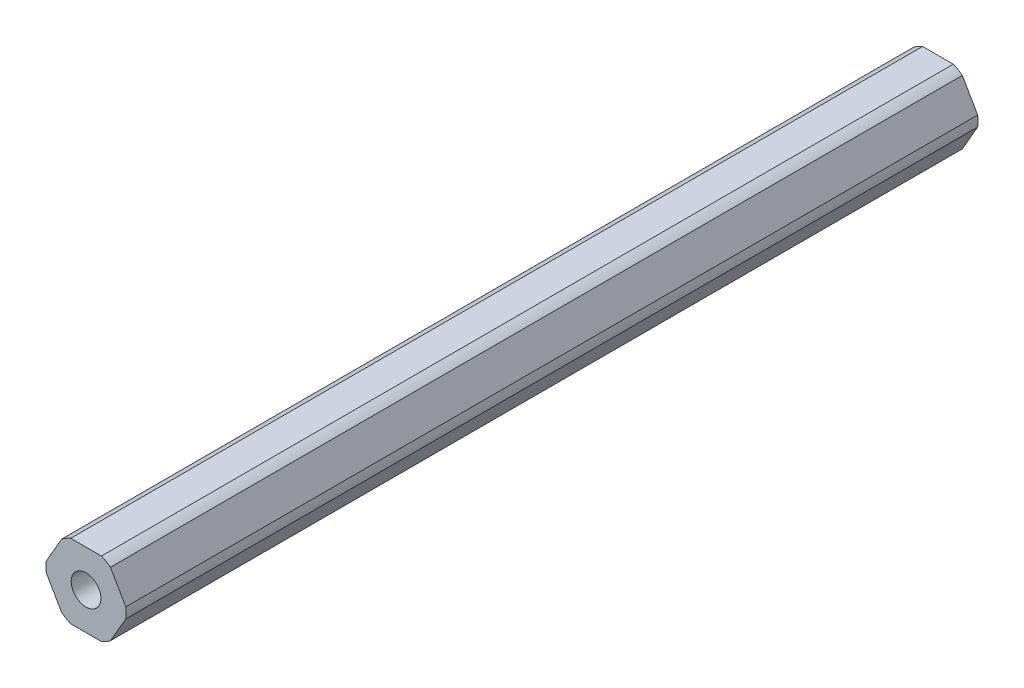
ISO-10303-21;
HEADER;
FILE_DESCRIPTION(('STEP AP214'),'2;1');
FILE_NAME('part.step','',(''),(''),'','','');
FILE_SCHEMA(('AUTOMOTIVE_DESIGN { 1 0 10303 214 1 1 1 1 }'));
ENDSEC;
DATA;
#1=APPLICATION_CONTEXT('core data for automotive mechanical design processes');
#2=APPLICATION_PROTOCOL_DEFINITION('international standard','automotive_design',2000,#1);
#3=PRODUCT_CONTEXT('',#1,'mechanical');
#4=PRODUCT('Part','Part','',(#3));
#5=PRODUCT_RELATED_PRODUCT_CATEGORY('part','',(#4));
#6=PRODUCT_DEFINITION_FORMATION('','',#4);
#7=PRODUCT_DEFINITION_CONTEXT('part definition',#1,'design');
#8=PRODUCT_DEFINITION('design','',#6,#7);
#9=PRODUCT_DEFINITION_SHAPE('','',#8);
#10=(LENGTH_UNIT() NAMED_UNIT(*) SI_UNIT(.MILLI.,.METRE.));
#11=(NAMED_UNIT(*) PLANE_ANGLE_UNIT() SI_UNIT($,.RADIAN.));
#12=(NAMED_UNIT(*) SI_UNIT($,.STERADIAN.) SOLID_ANGLE_UNIT());
#13=UNCERTAINTY_MEASURE_WITH_UNIT(LENGTH_MEASURE(1.E-05),#10,'distance_accuracy_value','');
#14=(GEOMETRIC_REPRESENTATION_CONTEXT(3) GLOBAL_UNCERTAINTY_ASSIGNED_CONTEXT((#13)) GLOBAL_UNIT_ASSIGNED_CONTEXT((#10,
#11,#12)) REPRESENTATION_CONTEXT('',''));
#15=CARTESIAN_POINT('',(0.,0.,0.));
#16=DIRECTION('',(0.,0.,1.));
#17=DIRECTION('',(1.,0.,0.));
#18=AXIS2_PLACEMENT_3D('',#15,#16,#17);
#19=CARTESIAN_POINT('',(0.,0.,146.05));
#20=DIRECTION('',(0.,0.,1.));
#21=DIRECTION('',(1.,0.,0.));
#22=AXIS2_PLACEMENT_3D('',#19,#20,#21);
#23=PLANE('',#22);
#24=CARTESIAN_POINT('',(0.,0.,146.05));
#25=DIRECTION('',(0.,0.,1.));
#26=DIRECTION('',(1.,0.,0.));
#27=AXIS2_PLACEMENT_3D('',#24,#25,#26);
#28=CIRCLE('',#27,6.875);
#29=CARTESIAN_POINT('',(-2.63498102459961,6.35,146.05));
#30=VERTEX_POINT('',#29);
#31=CARTESIAN_POINT('',(-4.18177080173138,5.45696050579321,146.05));
#32=VERTEX_POINT('',#31);
#33=EDGE_CURVE('E177',#30,#32,#28,.T.);
#34=ORIENTED_EDGE('',*,*,#33,.T.);
#35=DIRECTION('',(-0.5,-0.866025403784439,0.));
#36=VECTOR('',#35,1.);
#37=CARTESIAN_POINT('',(-4.18177080173138,5.45696050579321,146.05));
#38=LINE('',#37,#36);
#39=CARTESIAN_POINT('',(-6.81675182633099,0.893039494206796,146.05));
#40=VERTEX_POINT('',#39);
#41=EDGE_CURVE('E105',#32,#40,#38,.T.);
#42=ORIENTED_EDGE('',*,*,#41,.T.);
#43=CARTESIAN_POINT('',(0.,0.,146.05));
#44=DIRECTION('',(0.,0.,1.));
#45=DIRECTION('',(1.,0.,0.));
#46=AXIS2_PLACEMENT_3D('',#43,#44,#45);
#47=CIRCLE('',#46,6.875);
#48=CARTESIAN_POINT('',(-6.81675182633099,-0.893039494206789,146.05));
#49=VERTEX_POINT('',#48);
#50=EDGE_CURVE('E204',#40,#49,#47,.T.);
#51=ORIENTED_EDGE('',*,*,#50,.T.);
#52=DIRECTION('',(0.5,-0.866025403784438,0.));
#53=VECTOR('',#52,1.);
#54=CARTESIAN_POINT('',(-6.81675182633099,-0.893039494206789,146.05));
#55=LINE('',#54,#53);
#56=CARTESIAN_POINT('',(-4.18177080173138,-5.45696050579321,146.05));
#57=VERTEX_POINT('',#56);
#58=EDGE_CURVE('E223',#49,#57,#55,.T.);
#59=ORIENTED_EDGE('',*,*,#58,.T.);
#60=CARTESIAN_POINT('',(0.,0.,146.05));
#61=DIRECTION('',(0.,0.,1.));
#62=DIRECTION('',(1.,0.,0.));
#63=AXIS2_PLACEMENT_3D('',#60,#61,#62);
#64=CIRCLE('',#63,6.875);
#65=CARTESIAN_POINT('',(-2.63498102459961,-6.35,146.05));
#66=VERTEX_POINT('',#65);
#67=EDGE_CURVE('E220',#57,#66,#64,.T.);
#68=ORIENTED_EDGE('',*,*,#67,.T.);
#69=DIRECTION('',(1.,0.,0.));
#70=VECTOR('',#69,1.);
#71=CARTESIAN_POINT('',(-2.63498102459961,-6.35,146.05));
#72=LINE('',#71,#70);
#73=CARTESIAN_POINT('',(2.63498102459961,-6.35,146.05));
#74=VERTEX_POINT('',#73);
#75=EDGE_CURVE('E222',#66,#74,#72,.T.);
#76=ORIENTED_EDGE('',*,*,#75,.T.);
#77=CARTESIAN_POINT('',(0.,0.,146.05));
#78=DIRECTION('',(0.,0.,1.));
#79=DIRECTION('',(1.,0.,0.));
#80=AXIS2_PLACEMENT_3D('',#77,#78,#79);
#81=CIRCLE('',#80,6.875);
#82=CARTESIAN_POINT('',(4.18177080173138,-5.45696050579321,146.05));
#83=VERTEX_POINT('',#82);
#84=EDGE_CURVE('E225',#74,#83,#81,.T.);
#85=ORIENTED_EDGE('',*,*,#84,.T.);
#86=DIRECTION('',(0.5,0.866025403784439,0.));
#87=VECTOR('',#86,1.);
#88=CARTESIAN_POINT('',(4.18177080173138,-5.45696050579321,146.05));
#89=LINE('',#88,#87);
#90=CARTESIAN_POINT('',(6.81675182633099,-0.893039494206794,146.05));
#91=VERTEX_POINT('',#90);
#92=EDGE_CURVE('E231',#83,#91,#89,.T.);
#93=ORIENTED_EDGE('',*,*,#92,.T.);
#94=CARTESIAN_POINT('',(0.,0.,146.05));
#95=DIRECTION('',(0.,0.,1.));
#96=DIRECTION('',(1.,0.,0.));
#97=AXIS2_PLACEMENT_3D('',#94,#95,#96);
#98=CIRCLE('',#97,6.875);
#99=CARTESIAN_POINT('',(6.81675182633099,0.893039494206791,146.05));
#100=VERTEX_POINT('',#99);
#101=EDGE_CURVE('E136',#91,#100,#98,.T.);
#102=ORIENTED_EDGE('',*,*,#101,.T.);
#103=DIRECTION('',(-0.5,0.866025403784439,0.));
#104=VECTOR('',#103,1.);
#105=CARTESIAN_POINT('',(6.81675182633099,0.893039494206791,146.05));
#106=LINE('',#105,#104);
#107=CARTESIAN_POINT('',(4.18177080173138,5.45696050579321,146.05));
#108=VERTEX_POINT('',#107);
#109=EDGE_CURVE('E130',#100,#108,#106,.T.);
#110=ORIENTED_EDGE('',*,*,#109,.T.);
#111=CARTESIAN_POINT('',(0.,0.,146.05));
#112=DIRECTION('',(0.,0.,1.));
#113=DIRECTION('',(1.,0.,0.));
#114=AXIS2_PLACEMENT_3D('',#111,#112,#113);
#115=CIRCLE('',#114,6.875);
#116=CARTESIAN_POINT('',(2.6349810245996,6.35,146.05));
#117=VERTEX_POINT('',#116);
#118=EDGE_CURVE('E134',#108,#117,#115,.T.);
#119=ORIENTED_EDGE('',*,*,#118,.T.);
#120=DIRECTION('',(-1.,0.,0.));
#121=VECTOR('',#120,1.);
#122=CARTESIAN_POINT('',(2.6349810245996,6.35,146.05));
#123=LINE('',#122,#121);
#124=EDGE_CURVE('E50',#117,#30,#123,.T.);
#125=ORIENTED_EDGE('',*,*,#124,.T.);
#126=EDGE_LOOP('',(#34,#42,#51,#59,#68,#76,#85,#93,#102,#110,#119,#125));
#127=FACE_BOUND('',#126,.T.);
#128=CARTESIAN_POINT('',(0.,0.,146.05));
#129=DIRECTION('',(0.,0.,1.));
#130=DIRECTION('',(1.,0.,0.));
#131=AXIS2_PLACEMENT_3D('',#128,#129,#130);
#132=CIRCLE('',#131,2.55);
#133=CARTESIAN_POINT('',(2.55,0.,146.05));
#134=VERTEX_POINT('',#133);
#135=EDGE_CURVE('E158',#134,#134,#132,.T.);
#136=ORIENTED_EDGE('',*,*,#135,.F.);
#137=EDGE_LOOP('',(#136));
#138=FACE_BOUND('',#137,.T.);
#139=ADVANCED_FACE('F33',(#127,#138),#23,.T.);
#140=CARTESIAN_POINT('',(0.,0.,0.));
#141=DIRECTION('',(0.,0.,1.));
#142=DIRECTION('',(1.,0.,0.));
#143=AXIS2_PLACEMENT_3D('',#140,#141,#142);
#144=PLANE('',#143);
#145=CARTESIAN_POINT('',(0.,0.,0.));
#146=DIRECTION('',(0.,0.,1.));
#147=DIRECTION('',(1.,0.,0.));
#148=AXIS2_PLACEMENT_3D('',#145,#146,#147);
#149=CIRCLE('',#148,6.875);
#150=CARTESIAN_POINT('',(-2.63498102459961,6.35,0.));
#151=VERTEX_POINT('',#150);
#152=CARTESIAN_POINT('',(-4.18177080173138,5.45696050579321,0.));
#153=VERTEX_POINT('',#152);
#154=EDGE_CURVE('E154',#151,#153,#149,.T.);
#155=ORIENTED_EDGE('',*,*,#154,.F.);
#156=DIRECTION('',(-1.,0.,0.));
#157=VECTOR('',#156,1.);
#158=CARTESIAN_POINT('',(2.6349810245996,6.35,0.));
#159=LINE('',#158,#157);
#160=CARTESIAN_POINT('',(2.6349810245996,6.35,0.));
#161=VERTEX_POINT('',#160);
#162=EDGE_CURVE('E97',#161,#151,#159,.T.);
#163=ORIENTED_EDGE('',*,*,#162,.F.);
#164=CARTESIAN_POINT('',(0.,0.,0.));
#165=DIRECTION('',(0.,0.,1.));
#166=DIRECTION('',(1.,0.,0.));
#167=AXIS2_PLACEMENT_3D('',#164,#165,#166);
#168=CIRCLE('',#167,6.875);
#169=CARTESIAN_POINT('',(4.18177080173138,5.45696050579321,0.));
#170=VERTEX_POINT('',#169);
#171=EDGE_CURVE('E91',#170,#161,#168,.T.);
#172=ORIENTED_EDGE('',*,*,#171,.F.);
#173=DIRECTION('',(-0.5,0.866025403784439,0.));
#174=VECTOR('',#173,1.);
#175=CARTESIAN_POINT('',(6.81675182633099,0.893039494206791,0.));
#176=LINE('',#175,#174);
#177=CARTESIAN_POINT('',(6.81675182633099,0.893039494206791,0.));
#178=VERTEX_POINT('',#177);
#179=EDGE_CURVE('E144',#178,#170,#176,.T.);
#180=ORIENTED_EDGE('',*,*,#179,.F.);
#181=CARTESIAN_POINT('',(0.,0.,0.));
#182=DIRECTION('',(0.,0.,1.));
#183=DIRECTION('',(1.,0.,0.));
#184=AXIS2_PLACEMENT_3D('',#181,#182,#183);
#185=CIRCLE('',#184,6.875);
#186=CARTESIAN_POINT('',(6.81675182633099,-0.893039494206794,0.));
#187=VERTEX_POINT('',#186);
#188=EDGE_CURVE('E172',#187,#178,#185,.T.);
#189=ORIENTED_EDGE('',*,*,#188,.F.);
#190=DIRECTION('',(0.5,0.866025403784439,0.));
#191=VECTOR('',#190,1.);
#192=CARTESIAN_POINT('',(4.18177080173138,-5.45696050579321,0.));
#193=LINE('',#192,#191);
#194=CARTESIAN_POINT('',(4.18177080173138,-5.45696050579321,0.));
#195=VERTEX_POINT('',#194);
#196=EDGE_CURVE('E170',#195,#187,#193,.T.);
#197=ORIENTED_EDGE('',*,*,#196,.F.);
#198=CARTESIAN_POINT('',(0.,0.,0.));
#199=DIRECTION('',(0.,0.,1.));
#200=DIRECTION('',(1.,0.,0.));
#201=AXIS2_PLACEMENT_3D('',#198,#199,#200);
#202=CIRCLE('',#201,6.875);
#203=CARTESIAN_POINT('',(2.63498102459961,-6.35,0.));
#204=VERTEX_POINT('',#203);
#205=EDGE_CURVE('E168',#204,#195,#202,.T.);
#206=ORIENTED_EDGE('',*,*,#205,.F.);
#207=DIRECTION('',(1.,0.,0.));
#208=VECTOR('',#207,1.);
#209=CARTESIAN_POINT('',(-2.63498102459961,-6.35,0.));
#210=LINE('',#209,#208);
#211=CARTESIAN_POINT('',(-2.63498102459961,-6.35,0.));
#212=VERTEX_POINT('',#211);
#213=EDGE_CURVE('E166',#212,#204,#210,.T.);
#214=ORIENTED_EDGE('',*,*,#213,.F.);
#215=CARTESIAN_POINT('',(0.,0.,0.));
#216=DIRECTION('',(0.,0.,1.));
#217=DIRECTION('',(1.,0.,0.));
#218=AXIS2_PLACEMENT_3D('',#215,#216,#217);
#219=CIRCLE('',#218,6.875);
#220=CARTESIAN_POINT('',(-4.18177080173138,-5.45696050579321,0.));
#221=VERTEX_POINT('',#220);
#222=EDGE_CURVE('E164',#221,#212,#219,.T.);
#223=ORIENTED_EDGE('',*,*,#222,.F.);
#224=DIRECTION('',(0.5,-0.866025403784438,0.));
#225=VECTOR('',#224,1.);
#226=CARTESIAN_POINT('',(-6.81675182633099,-0.893039494206789,0.));
#227=LINE('',#226,#225);
#228=CARTESIAN_POINT('',(-6.81675182633099,-0.893039494206789,0.));
#229=VERTEX_POINT('',#228);
#230=EDGE_CURVE('E162',#229,#221,#227,.T.);
#231=ORIENTED_EDGE('',*,*,#230,.F.);
#232=CARTESIAN_POINT('',(0.,0.,0.));
#233=DIRECTION('',(0.,0.,1.));
#234=DIRECTION('',(1.,0.,0.));
#235=AXIS2_PLACEMENT_3D('',#232,#233,#234);
#236=CIRCLE('',#235,6.875);
#237=CARTESIAN_POINT('',(-6.81675182633099,0.893039494206796,0.));
#238=VERTEX_POINT('',#237);
#239=EDGE_CURVE('E160',#238,#229,#236,.T.);
#240=ORIENTED_EDGE('',*,*,#239,.F.);
#241=DIRECTION('',(-0.5,-0.866025403784439,0.));
#242=VECTOR('',#241,1.);
#243=CARTESIAN_POINT('',(-4.18177080173138,5.45696050579321,0.));
#244=LINE('',#243,#242);
#245=EDGE_CURVE('E157',#153,#238,#244,.T.);
#246=ORIENTED_EDGE('',*,*,#245,.F.);
#247=EDGE_LOOP('',(#155,#163,#172,#180,#189,#197,#206,#214,#223,#231,#240,#246));
#248=FACE_BOUND('',#247,.T.);
#249=CARTESIAN_POINT('',(0.,0.,0.));
#250=DIRECTION('',(0.,0.,1.));
#251=DIRECTION('',(1.,0.,0.));
#252=AXIS2_PLACEMENT_3D('',#249,#250,#251);
#253=CIRCLE('',#252,2.55);
#254=CARTESIAN_POINT('',(2.55,0.,0.));
#255=VERTEX_POINT('',#254);
#256=EDGE_CURVE('E378',#255,#255,#253,.T.);
#257=ORIENTED_EDGE('',*,*,#256,.T.);
#258=EDGE_LOOP('',(#257));
#259=FACE_BOUND('',#258,.T.);
#260=ADVANCED_FACE('F208',(#248,#259),#144,.F.);
#261=CARTESIAN_POINT('',(0.,0.,146.05));
#262=DIRECTION('',(0.,0.,-1.));
#263=DIRECTION('',(-1.,0.,0.));
#264=AXIS2_PLACEMENT_3D('',#261,#262,#263);
#265=CYLINDRICAL_SURFACE('',#264,6.875);
#266=ORIENTED_EDGE('',*,*,#154,.T.);
#267=DIRECTION('',(0.,0.,-1.));
#268=VECTOR('',#267,1.);
#269=CARTESIAN_POINT('',(-4.18177080173138,5.45696050579321,146.05));
#270=LINE('',#269,#268);
#271=EDGE_CURVE('E11',#32,#153,#270,.T.);
#272=ORIENTED_EDGE('',*,*,#271,.F.);
#273=ORIENTED_EDGE('',*,*,#33,.F.);
#274=DIRECTION('',(0.,0.,-1.));
#275=VECTOR('',#274,1.);
#276=CARTESIAN_POINT('',(-2.63498102459961,6.35,146.05));
#277=LINE('',#276,#275);
#278=EDGE_CURVE('E150',#30,#151,#277,.T.);
#279=ORIENTED_EDGE('',*,*,#278,.T.);
#280=EDGE_LOOP('',(#266,#272,#273,#279));
#281=FACE_BOUND('',#280,.T.);
#282=ADVANCED_FACE('F35',(#281),#265,.T.);
#283=CARTESIAN_POINT('',(-4.18177080173138,5.45696050579321,146.05));
#284=DIRECTION('',(0.866025403784439,-0.5,0.));
#285=DIRECTION('',(0.5,0.866025403784439,0.));
#286=AXIS2_PLACEMENT_3D('',#283,#284,#285);
#287=PLANE('',#286);
#288=ORIENTED_EDGE('',*,*,#245,.T.);
#289=DIRECTION('',(0.,0.,-1.));
#290=VECTOR('',#289,1.);
#291=CARTESIAN_POINT('',(-6.81675182633099,0.893039494206796,146.05));
#292=LINE('',#291,#290);
#293=EDGE_CURVE('E42',#40,#238,#292,.T.);
#294=ORIENTED_EDGE('',*,*,#293,.F.);
#295=ORIENTED_EDGE('',*,*,#41,.F.);
#296=ORIENTED_EDGE('',*,*,#271,.T.);
#297=EDGE_LOOP('',(#288,#294,#295,#296));
#298=FACE_BOUND('',#297,.T.);
#299=ADVANCED_FACE('F265',(#298),#287,.F.);
#300=CARTESIAN_POINT('',(0.,0.,146.05));
#301=DIRECTION('',(0.,0.,-1.));
#302=DIRECTION('',(-1.,0.,0.));
#303=AXIS2_PLACEMENT_3D('',#300,#301,#302);
#304=CYLINDRICAL_SURFACE('',#303,6.875);
#305=ORIENTED_EDGE('',*,*,#239,.T.);
#306=DIRECTION('',(0.,0.,-1.));
#307=VECTOR('',#306,1.);
#308=CARTESIAN_POINT('',(-6.81675182633099,-0.893039494206789,146.05));
#309=LINE('',#308,#307);
#310=EDGE_CURVE('E196',#49,#229,#309,.T.);
#311=ORIENTED_EDGE('',*,*,#310,.F.);
#312=ORIENTED_EDGE('',*,*,#50,.F.);
#313=ORIENTED_EDGE('',*,*,#293,.T.);
#314=EDGE_LOOP('',(#305,#311,#312,#313));
#315=FACE_BOUND('',#314,.T.);
#316=ADVANCED_FACE('F202',(#315),#304,.T.);
#317=CARTESIAN_POINT('',(-6.81675182633099,-0.893039494206789,146.05));
#318=DIRECTION('',(0.866025403784439,0.5,0.));
#319=DIRECTION('',(-0.5,0.866025403784439,0.));
#320=AXIS2_PLACEMENT_3D('',#317,#318,#319);
#321=PLANE('',#320);
#322=ORIENTED_EDGE('',*,*,#230,.T.);
#323=DIRECTION('',(0.,0.,-1.));
#324=VECTOR('',#323,1.);
#325=CARTESIAN_POINT('',(-4.18177080173138,-5.45696050579321,146.05));
#326=LINE('',#325,#324);
#327=EDGE_CURVE('E193',#57,#221,#326,.T.);
#328=ORIENTED_EDGE('',*,*,#327,.F.);
#329=ORIENTED_EDGE('',*,*,#58,.F.);
#330=ORIENTED_EDGE('',*,*,#310,.T.);
#331=EDGE_LOOP('',(#322,#328,#329,#330));
#332=FACE_BOUND('',#331,.T.);
#333=ADVANCED_FACE('F214',(#332),#321,.F.);
#334=CARTESIAN_POINT('',(0.,0.,146.05));
#335=DIRECTION('',(0.,0.,-1.));
#336=DIRECTION('',(-1.,0.,0.));
#337=AXIS2_PLACEMENT_3D('',#334,#335,#336);
#338=CYLINDRICAL_SURFACE('',#337,6.875);
#339=ORIENTED_EDGE('',*,*,#222,.T.);
#340=DIRECTION('',(0.,0.,-1.));
#341=VECTOR('',#340,1.);
#342=CARTESIAN_POINT('',(-2.63498102459961,-6.35,146.05));
#343=LINE('',#342,#341);
#344=EDGE_CURVE('E190',#66,#212,#343,.T.);
#345=ORIENTED_EDGE('',*,*,#344,.F.);
#346=ORIENTED_EDGE('',*,*,#67,.F.);
#347=ORIENTED_EDGE('',*,*,#327,.T.);
#348=EDGE_LOOP('',(#339,#345,#346,#347));
#349=FACE_BOUND('',#348,.T.);
#350=ADVANCED_FACE('F218',(#349),#338,.T.);
#351=CARTESIAN_POINT('',(-2.63498102459961,-6.35,146.05));
#352=DIRECTION('',(0.,1.,0.));
#353=DIRECTION('',(0.,0.,1.));
#354=AXIS2_PLACEMENT_3D('',#351,#352,#353);
#355=PLANE('',#354);
#356=ORIENTED_EDGE('',*,*,#213,.T.);
#357=DIRECTION('',(0.,0.,-1.));
#358=VECTOR('',#357,1.);
#359=CARTESIAN_POINT('',(2.63498102459961,-6.35,146.05));
#360=LINE('',#359,#358);
#361=EDGE_CURVE('E187',#74,#204,#360,.T.);
#362=ORIENTED_EDGE('',*,*,#361,.F.);
#363=ORIENTED_EDGE('',*,*,#75,.F.);
#364=ORIENTED_EDGE('',*,*,#344,.T.);
#365=EDGE_LOOP('',(#356,#362,#363,#364));
#366=FACE_BOUND('',#365,.T.);
#367=ADVANCED_FACE('F278',(#366),#355,.F.);
#368=CARTESIAN_POINT('',(0.,0.,146.05));
#369=DIRECTION('',(0.,0.,-1.));
#370=DIRECTION('',(-1.,0.,0.));
#371=AXIS2_PLACEMENT_3D('',#368,#369,#370);
#372=CYLINDRICAL_SURFACE('',#371,6.875);
#373=ORIENTED_EDGE('',*,*,#205,.T.);
#374=DIRECTION('',(0.,0.,-1.));
#375=VECTOR('',#374,1.);
#376=CARTESIAN_POINT('',(4.18177080173138,-5.45696050579321,146.05));
#377=LINE('',#376,#375);
#378=EDGE_CURVE('E184',#83,#195,#377,.T.);
#379=ORIENTED_EDGE('',*,*,#378,.F.);
#380=ORIENTED_EDGE('',*,*,#84,.F.);
#381=ORIENTED_EDGE('',*,*,#361,.T.);
#382=EDGE_LOOP('',(#373,#379,#380,#381));
#383=FACE_BOUND('',#382,.T.);
#384=ADVANCED_FACE('F281',(#383),#372,.T.);
#385=CARTESIAN_POINT('',(4.18177080173138,-5.45696050579321,146.05));
#386=DIRECTION('',(-0.866025403784439,0.5,0.));
#387=DIRECTION('',(-0.5,-0.866025403784439,0.));
#388=AXIS2_PLACEMENT_3D('',#385,#386,#387);
#389=PLANE('',#388);
#390=ORIENTED_EDGE('',*,*,#196,.T.);
#391=DIRECTION('',(0.,0.,-1.));
#392=VECTOR('',#391,1.);
#393=CARTESIAN_POINT('',(6.81675182633099,-0.893039494206794,146.05));
#394=LINE('',#393,#392);
#395=EDGE_CURVE('E181',#91,#187,#394,.T.);
#396=ORIENTED_EDGE('',*,*,#395,.F.);
#397=ORIENTED_EDGE('',*,*,#92,.F.);
#398=ORIENTED_EDGE('',*,*,#378,.T.);
#399=EDGE_LOOP('',(#390,#396,#397,#398));
#400=FACE_BOUND('',#399,.T.);
#401=ADVANCED_FACE('F237',(#400),#389,.F.);
#402=CARTESIAN_POINT('',(0.,0.,146.05));
#403=DIRECTION('',(0.,0.,-1.));
#404=DIRECTION('',(-1.,0.,0.));
#405=AXIS2_PLACEMENT_3D('',#402,#403,#404);
#406=CYLINDRICAL_SURFACE('',#405,6.875);
#407=ORIENTED_EDGE('',*,*,#188,.T.);
#408=DIRECTION('',(0.,0.,-1.));
#409=VECTOR('',#408,1.);
#410=CARTESIAN_POINT('',(6.81675182633099,0.893039494206791,146.05));
#411=LINE('',#410,#409);
#412=EDGE_CURVE('E145',#100,#178,#411,.T.);
#413=ORIENTED_EDGE('',*,*,#412,.F.);
#414=ORIENTED_EDGE('',*,*,#101,.F.);
#415=ORIENTED_EDGE('',*,*,#395,.T.);
#416=EDGE_LOOP('',(#407,#413,#414,#415));
#417=FACE_BOUND('',#416,.T.);
#418=ADVANCED_FACE('F241',(#417),#406,.T.);
#419=CARTESIAN_POINT('',(6.81675182633099,0.893039494206791,146.05));
#420=DIRECTION('',(-0.866025403784439,-0.5,0.));
#421=DIRECTION('',(0.5,-0.866025403784439,0.));
#422=AXIS2_PLACEMENT_3D('',#419,#420,#421);
#423=PLANE('',#422);
#424=ORIENTED_EDGE('',*,*,#179,.T.);
#425=DIRECTION('',(0.,0.,-1.));
#426=VECTOR('',#425,1.);
#427=CARTESIAN_POINT('',(4.18177080173138,5.45696050579321,146.05));
#428=LINE('',#427,#426);
#429=EDGE_CURVE('E141',#108,#170,#428,.T.);
#430=ORIENTED_EDGE('',*,*,#429,.F.);
#431=ORIENTED_EDGE('',*,*,#109,.F.);
#432=ORIENTED_EDGE('',*,*,#412,.T.);
#433=EDGE_LOOP('',(#424,#430,#431,#432));
#434=FACE_BOUND('',#433,.T.);
#435=ADVANCED_FACE('F142',(#434),#423,.F.);
#436=CARTESIAN_POINT('',(0.,0.,146.05));
#437=DIRECTION('',(0.,0.,-1.));
#438=DIRECTION('',(-1.,0.,0.));
#439=AXIS2_PLACEMENT_3D('',#436,#437,#438);
#440=CYLINDRICAL_SURFACE('',#439,6.875);
#441=ORIENTED_EDGE('',*,*,#171,.T.);
#442=DIRECTION('',(0.,0.,-1.));
#443=VECTOR('',#442,1.);
#444=CARTESIAN_POINT('',(2.6349810245996,6.35,146.05));
#445=LINE('',#444,#443);
#446=EDGE_CURVE('E146',#117,#161,#445,.T.);
#447=ORIENTED_EDGE('',*,*,#446,.F.);
#448=ORIENTED_EDGE('',*,*,#118,.F.);
#449=ORIENTED_EDGE('',*,*,#429,.T.);
#450=EDGE_LOOP('',(#441,#447,#448,#449));
#451=FACE_BOUND('',#450,.T.);
#452=ADVANCED_FACE('F148',(#451),#440,.T.);
#453=CARTESIAN_POINT('',(2.6349810245996,6.35,146.05));
#454=DIRECTION('',(0.,-1.,0.));
#455=DIRECTION('',(1.,0.,0.));
#456=AXIS2_PLACEMENT_3D('',#453,#454,#455);
#457=PLANE('',#456);
#458=ORIENTED_EDGE('',*,*,#162,.T.);
#459=ORIENTED_EDGE('',*,*,#278,.F.);
#460=ORIENTED_EDGE('',*,*,#124,.F.);
#461=ORIENTED_EDGE('',*,*,#446,.T.);
#462=EDGE_LOOP('',(#458,#459,#460,#461));
#463=FACE_BOUND('',#462,.T.);
#464=ADVANCED_FACE('F245',(#463),#457,.F.);
#465=CARTESIAN_POINT('',(0.,0.,146.05));
#466=DIRECTION('',(0.,0.,-1.));
#467=DIRECTION('',(-1.,0.,0.));
#468=AXIS2_PLACEMENT_3D('',#465,#466,#467);
#469=CYLINDRICAL_SURFACE('',#468,2.55);
#470=ORIENTED_EDGE('',*,*,#135,.T.);
#471=EDGE_LOOP('',(#470));
#472=FACE_BOUND('',#471,.T.);
#473=ORIENTED_EDGE('',*,*,#256,.F.);
#474=EDGE_LOOP('',(#473));
#475=FACE_BOUND('',#474,.T.);
#476=ADVANCED_FACE('F247',(#472,#475),#469,.F.);
#477=CLOSED_SHELL('',(#139,#260,#282,#299,#316,#333,#350,#367,#384,#401,#418,#435,#452,#464,#476));
#478=MANIFOLD_SOLID_BREP('B2',#477);
#479=ADVANCED_BREP_SHAPE_REPRESENTATION('',(#18,#478),#14);
#480=SHAPE_DEFINITION_REPRESENTATION(#9,#479);
ENDSEC;
END-ISO-10303-21;
